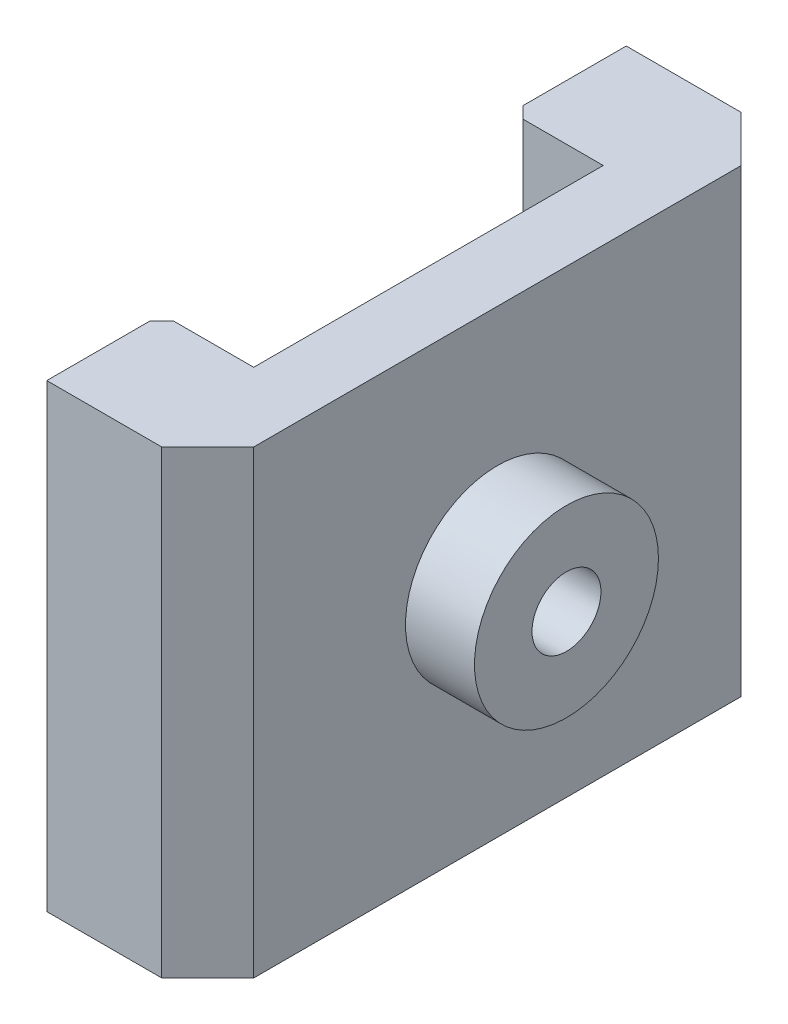
ISO-10303-21;
HEADER;
FILE_DESCRIPTION(('STEP AP214'),'2;1');
FILE_NAME('part.step','',(''),(''),'','','');
FILE_SCHEMA(('AUTOMOTIVE_DESIGN { 1 0 10303 214 1 1 1 1 }'));
ENDSEC;
DATA;
#1=APPLICATION_CONTEXT('core data for automotive mechanical design processes');
#2=APPLICATION_PROTOCOL_DEFINITION('international standard','automotive_design',2000,#1);
#3=PRODUCT_CONTEXT('',#1,'mechanical');
#4=PRODUCT('Part','Part','',(#3));
#5=PRODUCT_RELATED_PRODUCT_CATEGORY('part','',(#4));
#6=PRODUCT_DEFINITION_FORMATION('','',#4);
#7=PRODUCT_DEFINITION_CONTEXT('part definition',#1,'design');
#8=PRODUCT_DEFINITION('design','',#6,#7);
#9=PRODUCT_DEFINITION_SHAPE('','',#8);
#10=(LENGTH_UNIT() NAMED_UNIT(*) SI_UNIT(.MILLI.,.METRE.));
#11=(NAMED_UNIT(*) PLANE_ANGLE_UNIT() SI_UNIT($,.RADIAN.));
#12=(NAMED_UNIT(*) SI_UNIT($,.STERADIAN.) SOLID_ANGLE_UNIT());
#13=UNCERTAINTY_MEASURE_WITH_UNIT(LENGTH_MEASURE(1.E-05),#10,'distance_accuracy_value','');
#14=(GEOMETRIC_REPRESENTATION_CONTEXT(3) GLOBAL_UNCERTAINTY_ASSIGNED_CONTEXT((#13)) GLOBAL_UNIT_ASSIGNED_CONTEXT((#10,
#11,#12)) REPRESENTATION_CONTEXT('',''));
#15=CARTESIAN_POINT('',(0.,0.,0.));
#16=DIRECTION('',(0.,0.,1.));
#17=DIRECTION('',(1.,0.,0.));
#18=AXIS2_PLACEMENT_3D('',#15,#16,#17);
#19=CARTESIAN_POINT('',(-7.,20.,-7.6));
#20=DIRECTION('',(1.,0.,0.));
#21=DIRECTION('',(0.,0.,-1.));
#22=AXIS2_PLACEMENT_3D('',#19,#20,#21);
#23=PLANE('',#22);
#24=DIRECTION('',(0.,0.,1.));
#25=VECTOR('',#24,1.);
#26=CARTESIAN_POINT('',(-7.,0.,-7.6));
#27=LINE('',#26,#25);
#28=CARTESIAN_POINT('',(-7.,0.,-12.6));
#29=VERTEX_POINT('',#28);
#30=CARTESIAN_POINT('',(-7.,0.,-8.1));
#31=VERTEX_POINT('',#30);
#32=EDGE_CURVE('E166',#29,#31,#27,.T.);
#33=ORIENTED_EDGE('',*,*,#32,.T.);
#34=DIRECTION('',(0.,1.,0.));
#35=VECTOR('',#34,1.);
#36=CARTESIAN_POINT('',(-7.,20.,-8.1));
#37=LINE('',#36,#35);
#38=CARTESIAN_POINT('',(-7.,20.,-8.1));
#39=VERTEX_POINT('',#38);
#40=EDGE_CURVE('E214',#31,#39,#37,.T.);
#41=ORIENTED_EDGE('',*,*,#40,.T.);
#42=DIRECTION('',(0.,0.,1.));
#43=VECTOR('',#42,1.);
#44=CARTESIAN_POINT('',(-7.,20.,-7.6));
#45=LINE('',#44,#43);
#46=CARTESIAN_POINT('',(-7.,20.,-12.6));
#47=VERTEX_POINT('',#46);
#48=EDGE_CURVE('E136',#47,#39,#45,.T.);
#49=ORIENTED_EDGE('',*,*,#48,.F.);
#50=DIRECTION('',(0.,-1.,0.));
#51=VECTOR('',#50,1.);
#52=CARTESIAN_POINT('',(-7.,20.,-12.6));
#53=LINE('',#52,#51);
#54=EDGE_CURVE('E165',#47,#29,#53,.T.);
#55=ORIENTED_EDGE('',*,*,#54,.T.);
#56=EDGE_LOOP('',(#33,#41,#49,#55));
#57=FACE_BOUND('',#56,.T.);
#58=ADVANCED_FACE('F35',(#57),#23,.F.);
#59=CARTESIAN_POINT('',(-3.,20.,-7.6));
#60=DIRECTION('',(0.,0.,-1.));
#61=DIRECTION('',(-1.,0.,0.));
#62=AXIS2_PLACEMENT_3D('',#59,#60,#61);
#63=PLANE('',#62);
#64=DIRECTION('',(1.,0.,0.));
#65=VECTOR('',#64,1.);
#66=CARTESIAN_POINT('',(-3.,20.,-7.6));
#67=LINE('',#66,#65);
#68=CARTESIAN_POINT('',(-6.5,20.,-7.6));
#69=VERTEX_POINT('',#68);
#70=CARTESIAN_POINT('',(-3.,20.,-7.6));
#71=VERTEX_POINT('',#70);
#72=EDGE_CURVE('E124',#69,#71,#67,.T.);
#73=ORIENTED_EDGE('',*,*,#72,.F.);
#74=DIRECTION('',(0.,-1.,0.));
#75=VECTOR('',#74,1.);
#76=CARTESIAN_POINT('',(-6.5,20.,-7.6));
#77=LINE('',#76,#75);
#78=CARTESIAN_POINT('',(-6.5,0.,-7.6));
#79=VERTEX_POINT('',#78);
#80=EDGE_CURVE('E208',#69,#79,#77,.T.);
#81=ORIENTED_EDGE('',*,*,#80,.T.);
#82=DIRECTION('',(1.,0.,0.));
#83=VECTOR('',#82,1.);
#84=CARTESIAN_POINT('',(-3.,0.,-7.6));
#85=LINE('',#84,#83);
#86=CARTESIAN_POINT('',(-3.,0.,-7.6));
#87=VERTEX_POINT('',#86);
#88=EDGE_CURVE('E142',#79,#87,#85,.T.);
#89=ORIENTED_EDGE('',*,*,#88,.T.);
#90=DIRECTION('',(0.,-1.,0.));
#91=VECTOR('',#90,1.);
#92=CARTESIAN_POINT('',(-3.,20.,-7.6));
#93=LINE('',#92,#91);
#94=EDGE_CURVE('E139',#71,#87,#93,.T.);
#95=ORIENTED_EDGE('',*,*,#94,.F.);
#96=EDGE_LOOP('',(#73,#81,#89,#95));
#97=FACE_BOUND('',#96,.T.);
#98=ADVANCED_FACE('F140',(#97),#63,.F.);
#99=CARTESIAN_POINT('',(-3.,20.,7.6));
#100=DIRECTION('',(1.,0.,0.));
#101=DIRECTION('',(0.,0.,-1.));
#102=AXIS2_PLACEMENT_3D('',#99,#100,#101);
#103=PLANE('',#102);
#104=CARTESIAN_POINT('',(-3.,10.,0.));
#105=DIRECTION('',(1.,0.,0.));
#106=DIRECTION('',(0.,0.,-1.));
#107=AXIS2_PLACEMENT_3D('',#104,#105,#106);
#108=CIRCLE('',#107,1.5);
#109=CARTESIAN_POINT('',(-3.,10.,-1.5));
#110=VERTEX_POINT('',#109);
#111=EDGE_CURVE('E258',#110,#110,#108,.T.);
#112=ORIENTED_EDGE('',*,*,#111,.T.);
#113=EDGE_LOOP('',(#112));
#114=FACE_BOUND('',#113,.T.);
#115=DIRECTION('',(0.,0.,1.));
#116=VECTOR('',#115,1.);
#117=CARTESIAN_POINT('',(-3.,0.,7.6));
#118=LINE('',#117,#116);
#119=CARTESIAN_POINT('',(-3.,0.,7.6));
#120=VERTEX_POINT('',#119);
#121=EDGE_CURVE('E171',#87,#120,#118,.T.);
#122=ORIENTED_EDGE('',*,*,#121,.T.);
#123=DIRECTION('',(0.,-1.,0.));
#124=VECTOR('',#123,1.);
#125=CARTESIAN_POINT('',(-3.,20.,7.6));
#126=LINE('',#125,#124);
#127=CARTESIAN_POINT('',(-3.,20.,7.6));
#128=VERTEX_POINT('',#127);
#129=EDGE_CURVE('E146',#128,#120,#126,.T.);
#130=ORIENTED_EDGE('',*,*,#129,.F.);
#131=DIRECTION('',(0.,0.,1.));
#132=VECTOR('',#131,1.);
#133=CARTESIAN_POINT('',(-3.,20.,7.6));
#134=LINE('',#133,#132);
#135=EDGE_CURVE('E129',#71,#128,#134,.T.);
#136=ORIENTED_EDGE('',*,*,#135,.F.);
#137=ORIENTED_EDGE('',*,*,#94,.T.);
#138=EDGE_LOOP('',(#122,#130,#136,#137));
#139=FACE_BOUND('',#138,.T.);
#140=ADVANCED_FACE('F148',(#114,#139),#103,.F.);
#141=CARTESIAN_POINT('',(-7.,20.,7.6));
#142=DIRECTION('',(0.,0.,1.));
#143=DIRECTION('',(1.,0.,0.));
#144=AXIS2_PLACEMENT_3D('',#141,#142,#143);
#145=PLANE('',#144);
#146=DIRECTION('',(-1.,0.,0.));
#147=VECTOR('',#146,1.);
#148=CARTESIAN_POINT('',(-7.,0.,7.6));
#149=LINE('',#148,#147);
#150=CARTESIAN_POINT('',(-6.49999999999999,0.,7.6));
#151=VERTEX_POINT('',#150);
#152=EDGE_CURVE('E173',#120,#151,#149,.T.);
#153=ORIENTED_EDGE('',*,*,#152,.T.);
#154=DIRECTION('',(0.,1.,0.));
#155=VECTOR('',#154,1.);
#156=CARTESIAN_POINT('',(-6.49999999999999,20.,7.6));
#157=LINE('',#156,#155);
#158=CARTESIAN_POINT('',(-6.49999999999999,20.,7.6));
#159=VERTEX_POINT('',#158);
#160=EDGE_CURVE('E39',#151,#159,#157,.T.);
#161=ORIENTED_EDGE('',*,*,#160,.T.);
#162=DIRECTION('',(-1.,0.,0.));
#163=VECTOR('',#162,1.);
#164=CARTESIAN_POINT('',(-7.,20.,7.6));
#165=LINE('',#164,#163);
#166=EDGE_CURVE('E150',#128,#159,#165,.T.);
#167=ORIENTED_EDGE('',*,*,#166,.F.);
#168=ORIENTED_EDGE('',*,*,#129,.T.);
#169=EDGE_LOOP('',(#153,#161,#167,#168));
#170=FACE_BOUND('',#169,.T.);
#171=ADVANCED_FACE('F307',(#170),#145,.F.);
#172=CARTESIAN_POINT('',(-7.,20.,12.6));
#173=DIRECTION('',(1.,0.,0.));
#174=DIRECTION('',(0.,0.,-1.));
#175=AXIS2_PLACEMENT_3D('',#172,#173,#174);
#176=PLANE('',#175);
#177=DIRECTION('',(0.,0.,1.));
#178=VECTOR('',#177,1.);
#179=CARTESIAN_POINT('',(-7.,20.,12.6));
#180=LINE('',#179,#178);
#181=CARTESIAN_POINT('',(-7.,20.,8.10000000000001));
#182=VERTEX_POINT('',#181);
#183=CARTESIAN_POINT('',(-7.,20.,12.6));
#184=VERTEX_POINT('',#183);
#185=EDGE_CURVE('E152',#182,#184,#180,.T.);
#186=ORIENTED_EDGE('',*,*,#185,.F.);
#187=DIRECTION('',(0.,-1.,0.));
#188=VECTOR('',#187,1.);
#189=CARTESIAN_POINT('',(-7.,20.,8.10000000000001));
#190=LINE('',#189,#188);
#191=CARTESIAN_POINT('',(-7.,0.,8.10000000000001));
#192=VERTEX_POINT('',#191);
#193=EDGE_CURVE('E217',#182,#192,#190,.T.);
#194=ORIENTED_EDGE('',*,*,#193,.T.);
#195=DIRECTION('',(0.,0.,1.));
#196=VECTOR('',#195,1.);
#197=CARTESIAN_POINT('',(-7.,0.,12.6));
#198=LINE('',#197,#196);
#199=CARTESIAN_POINT('',(-7.,0.,12.6));
#200=VERTEX_POINT('',#199);
#201=EDGE_CURVE('E175',#192,#200,#198,.T.);
#202=ORIENTED_EDGE('',*,*,#201,.T.);
#203=DIRECTION('',(0.,-1.,0.));
#204=VECTOR('',#203,1.);
#205=CARTESIAN_POINT('',(-7.,20.,12.6));
#206=LINE('',#205,#204);
#207=EDGE_CURVE('E187',#184,#200,#206,.T.);
#208=ORIENTED_EDGE('',*,*,#207,.F.);
#209=EDGE_LOOP('',(#186,#194,#202,#208));
#210=FACE_BOUND('',#209,.T.);
#211=ADVANCED_FACE('F222',(#210),#176,.F.);
#212=CARTESIAN_POINT('',(0.,20.,12.6));
#213=DIRECTION('',(0.,0.,-1.));
#214=DIRECTION('',(-1.,0.,0.));
#215=AXIS2_PLACEMENT_3D('',#212,#213,#214);
#216=PLANE('',#215);
#217=DIRECTION('',(1.,0.,0.));
#218=VECTOR('',#217,1.);
#219=CARTESIAN_POINT('',(0.,0.,12.6));
#220=LINE('',#219,#218);
#221=CARTESIAN_POINT('',(-2.00000000000001,0.,12.6));
#222=VERTEX_POINT('',#221);
#223=EDGE_CURVE('E177',#200,#222,#220,.T.);
#224=ORIENTED_EDGE('',*,*,#223,.T.);
#225=DIRECTION('',(0.,1.,0.));
#226=VECTOR('',#225,1.);
#227=CARTESIAN_POINT('',(-2.00000000000001,20.,12.6));
#228=LINE('',#227,#226);
#229=CARTESIAN_POINT('',(-2.00000000000001,20.,12.6));
#230=VERTEX_POINT('',#229);
#231=EDGE_CURVE('E206',#222,#230,#228,.T.);
#232=ORIENTED_EDGE('',*,*,#231,.T.);
#233=DIRECTION('',(1.,0.,0.));
#234=VECTOR('',#233,1.);
#235=CARTESIAN_POINT('',(0.,20.,12.6));
#236=LINE('',#235,#234);
#237=EDGE_CURVE('E157',#184,#230,#236,.T.);
#238=ORIENTED_EDGE('',*,*,#237,.F.);
#239=ORIENTED_EDGE('',*,*,#207,.T.);
#240=EDGE_LOOP('',(#224,#232,#238,#239));
#241=FACE_BOUND('',#240,.T.);
#242=ADVANCED_FACE('F232',(#241),#216,.F.);
#243=CARTESIAN_POINT('',(0.,20.,-12.6));
#244=DIRECTION('',(-1.,0.,0.));
#245=DIRECTION('',(0.,0.,1.));
#246=AXIS2_PLACEMENT_3D('',#243,#244,#245);
#247=PLANE('',#246);
#248=CARTESIAN_POINT('',(0.,10.,0.));
#249=DIRECTION('',(1.,0.,0.));
#250=DIRECTION('',(0.,0.,-1.));
#251=AXIS2_PLACEMENT_3D('',#248,#249,#250);
#252=CIRCLE('',#251,4.);
#253=CARTESIAN_POINT('',(0.,10.,-4.));
#254=VERTEX_POINT('',#253);
#255=EDGE_CURVE('E11',#254,#254,#252,.T.);
#256=ORIENTED_EDGE('',*,*,#255,.F.);
#257=EDGE_LOOP('',(#256));
#258=FACE_BOUND('',#257,.T.);
#259=DIRECTION('',(0.,0.,-1.));
#260=VECTOR('',#259,1.);
#261=CARTESIAN_POINT('',(0.,0.,-12.6));
#262=LINE('',#261,#260);
#263=CARTESIAN_POINT('',(0.,0.,10.6));
#264=VERTEX_POINT('',#263);
#265=CARTESIAN_POINT('',(0.,0.,-10.6));
#266=VERTEX_POINT('',#265);
#267=EDGE_CURVE('E180',#264,#266,#262,.T.);
#268=ORIENTED_EDGE('',*,*,#267,.T.);
#269=DIRECTION('',(0.,1.,0.));
#270=VECTOR('',#269,1.);
#271=CARTESIAN_POINT('',(0.,20.,-10.6));
#272=LINE('',#271,#270);
#273=CARTESIAN_POINT('',(0.,20.,-10.6));
#274=VERTEX_POINT('',#273);
#275=EDGE_CURVE('E200',#266,#274,#272,.T.);
#276=ORIENTED_EDGE('',*,*,#275,.T.);
#277=DIRECTION('',(0.,0.,-1.));
#278=VECTOR('',#277,1.);
#279=CARTESIAN_POINT('',(0.,20.,-12.6));
#280=LINE('',#279,#278);
#281=CARTESIAN_POINT('',(0.,20.,10.6));
#282=VERTEX_POINT('',#281);
#283=EDGE_CURVE('E160',#282,#274,#280,.T.);
#284=ORIENTED_EDGE('',*,*,#283,.F.);
#285=DIRECTION('',(0.,-1.,0.));
#286=VECTOR('',#285,1.);
#287=CARTESIAN_POINT('',(0.,20.,10.6));
#288=LINE('',#287,#286);
#289=EDGE_CURVE('E197',#282,#264,#288,.T.);
#290=ORIENTED_EDGE('',*,*,#289,.T.);
#291=EDGE_LOOP('',(#268,#276,#284,#290));
#292=FACE_BOUND('',#291,.T.);
#293=ADVANCED_FACE('F241',(#258,#292),#247,.F.);
#294=CARTESIAN_POINT('',(-7.,20.,-12.6));
#295=DIRECTION('',(0.,0.,1.));
#296=DIRECTION('',(1.,0.,0.));
#297=AXIS2_PLACEMENT_3D('',#294,#295,#296);
#298=PLANE('',#297);
#299=DIRECTION('',(-1.,0.,0.));
#300=VECTOR('',#299,1.);
#301=CARTESIAN_POINT('',(-7.,20.,-12.6));
#302=LINE('',#301,#300);
#303=CARTESIAN_POINT('',(-2.,20.,-12.6));
#304=VERTEX_POINT('',#303);
#305=EDGE_CURVE('E163',#304,#47,#302,.T.);
#306=ORIENTED_EDGE('',*,*,#305,.F.);
#307=DIRECTION('',(0.,-1.,0.));
#308=VECTOR('',#307,1.);
#309=CARTESIAN_POINT('',(-2.,20.,-12.6));
#310=LINE('',#309,#308);
#311=CARTESIAN_POINT('',(-2.,0.,-12.6));
#312=VERTEX_POINT('',#311);
#313=EDGE_CURVE('E145',#304,#312,#310,.T.);
#314=ORIENTED_EDGE('',*,*,#313,.T.);
#315=DIRECTION('',(-1.,0.,0.));
#316=VECTOR('',#315,1.);
#317=CARTESIAN_POINT('',(-7.,0.,-12.6));
#318=LINE('',#317,#316);
#319=EDGE_CURVE('E183',#312,#29,#318,.T.);
#320=ORIENTED_EDGE('',*,*,#319,.T.);
#321=ORIENTED_EDGE('',*,*,#54,.F.);
#322=EDGE_LOOP('',(#306,#314,#320,#321));
#323=FACE_BOUND('',#322,.T.);
#324=ADVANCED_FACE('F249',(#323),#298,.F.);
#325=CARTESIAN_POINT('',(0.,20.,0.));
#326=DIRECTION('',(0.,-1.,0.));
#327=DIRECTION('',(0.,0.,-1.));
#328=AXIS2_PLACEMENT_3D('',#325,#326,#327);
#329=PLANE('',#328);
#330=ORIENTED_EDGE('',*,*,#48,.T.);
#331=DIRECTION('',(-0.707106781186546,0.,-0.707106781186549));
#332=VECTOR('',#331,1.);
#333=CARTESIAN_POINT('',(-6.5,20.,-7.6));
#334=LINE('',#333,#332);
#335=EDGE_CURVE('E132',#39,#69,#334,.F.);
#336=ORIENTED_EDGE('',*,*,#335,.T.);
#337=ORIENTED_EDGE('',*,*,#72,.T.);
#338=ORIENTED_EDGE('',*,*,#135,.T.);
#339=ORIENTED_EDGE('',*,*,#166,.T.);
#340=DIRECTION('',(0.707106781186551,0.,-0.707106781186544));
#341=VECTOR('',#340,1.);
#342=CARTESIAN_POINT('',(-7.,20.,8.10000000000001));
#343=LINE('',#342,#341);
#344=EDGE_CURVE('E51',#159,#182,#343,.F.);
#345=ORIENTED_EDGE('',*,*,#344,.T.);
#346=ORIENTED_EDGE('',*,*,#185,.T.);
#347=ORIENTED_EDGE('',*,*,#237,.T.);
#348=DIRECTION('',(-0.707106781186548,0.,0.707106781186547));
#349=VECTOR('',#348,1.);
#350=CARTESIAN_POINT('',(0.,20.,10.6));
#351=LINE('',#350,#349);
#352=EDGE_CURVE('E202',#230,#282,#351,.F.);
#353=ORIENTED_EDGE('',*,*,#352,.T.);
#354=ORIENTED_EDGE('',*,*,#283,.T.);
#355=DIRECTION('',(0.707106781186547,0.,0.707106781186548));
#356=VECTOR('',#355,1.);
#357=CARTESIAN_POINT('',(-2.,20.,-12.6));
#358=LINE('',#357,#356);
#359=EDGE_CURVE('E204',#274,#304,#358,.F.);
#360=ORIENTED_EDGE('',*,*,#359,.T.);
#361=ORIENTED_EDGE('',*,*,#305,.T.);
#362=EDGE_LOOP('',(#330,#336,#337,#338,#339,#345,#346,#347,#353,#354,#360,#361));
#363=FACE_BOUND('',#362,.T.);
#364=ADVANCED_FACE('F127',(#363),#329,.F.);
#365=CARTESIAN_POINT('',(0.,0.,0.));
#366=DIRECTION('',(0.,-1.,0.));
#367=DIRECTION('',(0.,0.,-1.));
#368=AXIS2_PLACEMENT_3D('',#365,#366,#367);
#369=PLANE('',#368);
#370=ORIENTED_EDGE('',*,*,#88,.F.);
#371=DIRECTION('',(0.707106781186546,0.,0.707106781186549));
#372=VECTOR('',#371,1.);
#373=CARTESIAN_POINT('',(0.549999999999982,0.,-0.54999999999998));
#374=LINE('',#373,#372);
#375=EDGE_CURVE('E212',#79,#31,#374,.F.);
#376=ORIENTED_EDGE('',*,*,#375,.T.);
#377=ORIENTED_EDGE('',*,*,#32,.F.);
#378=ORIENTED_EDGE('',*,*,#319,.F.);
#379=DIRECTION('',(-0.707106781186547,0.,-0.707106781186548));
#380=VECTOR('',#379,1.);
#381=CARTESIAN_POINT('',(5.3,0.,-5.29999999999999));
#382=LINE('',#381,#380);
#383=EDGE_CURVE('E195',#312,#266,#382,.F.);
#384=ORIENTED_EDGE('',*,*,#383,.T.);
#385=ORIENTED_EDGE('',*,*,#267,.F.);
#386=DIRECTION('',(0.707106781186548,0.,-0.707106781186547));
#387=VECTOR('',#386,1.);
#388=CARTESIAN_POINT('',(5.3,0.,5.30000000000001));
#389=LINE('',#388,#387);
#390=EDGE_CURVE('E193',#264,#222,#389,.F.);
#391=ORIENTED_EDGE('',*,*,#390,.T.);
#392=ORIENTED_EDGE('',*,*,#223,.F.);
#393=ORIENTED_EDGE('',*,*,#201,.F.);
#394=DIRECTION('',(-0.707106781186551,0.,0.707106781186544));
#395=VECTOR('',#394,1.);
#396=CARTESIAN_POINT('',(0.550000000000034,0.,0.550000000000039));
#397=LINE('',#396,#395);
#398=EDGE_CURVE('E210',#192,#151,#397,.F.);
#399=ORIENTED_EDGE('',*,*,#398,.T.);
#400=ORIENTED_EDGE('',*,*,#152,.F.);
#401=ORIENTED_EDGE('',*,*,#121,.F.);
#402=EDGE_LOOP('',(#370,#376,#377,#378,#384,#385,#391,#392,#393,#399,#400,#401));
#403=FACE_BOUND('',#402,.T.);
#404=ADVANCED_FACE('F227',(#403),#369,.T.);
#405=CARTESIAN_POINT('',(-2.,20.,-12.6));
#406=DIRECTION('',(-0.707106781186548,0.,0.707106781186547));
#407=DIRECTION('',(0.,-1.,0.));
#408=AXIS2_PLACEMENT_3D('',#405,#406,#407);
#409=PLANE('',#408);
#410=ORIENTED_EDGE('',*,*,#359,.F.);
#411=ORIENTED_EDGE('',*,*,#275,.F.);
#412=ORIENTED_EDGE('',*,*,#383,.F.);
#413=ORIENTED_EDGE('',*,*,#313,.F.);
#414=EDGE_LOOP('',(#410,#411,#412,#413));
#415=FACE_BOUND('',#414,.T.);
#416=ADVANCED_FACE('F244',(#415),#409,.F.);
#417=CARTESIAN_POINT('',(0.,20.,10.6));
#418=DIRECTION('',(-0.707106781186547,0.,-0.707106781186548));
#419=DIRECTION('',(0.,-1.,0.));
#420=AXIS2_PLACEMENT_3D('',#417,#418,#419);
#421=PLANE('',#420);
#422=ORIENTED_EDGE('',*,*,#352,.F.);
#423=ORIENTED_EDGE('',*,*,#231,.F.);
#424=ORIENTED_EDGE('',*,*,#390,.F.);
#425=ORIENTED_EDGE('',*,*,#289,.F.);
#426=EDGE_LOOP('',(#422,#423,#424,#425));
#427=FACE_BOUND('',#426,.T.);
#428=ADVANCED_FACE('F236',(#427),#421,.F.);
#429=CARTESIAN_POINT('',(-6.5,20.,-7.6));
#430=DIRECTION('',(0.707106781186549,0.,-0.707106781186546));
#431=DIRECTION('',(0.,-1.,0.));
#432=AXIS2_PLACEMENT_3D('',#429,#430,#431);
#433=PLANE('',#432);
#434=ORIENTED_EDGE('',*,*,#335,.F.);
#435=ORIENTED_EDGE('',*,*,#40,.F.);
#436=ORIENTED_EDGE('',*,*,#375,.F.);
#437=ORIENTED_EDGE('',*,*,#80,.F.);
#438=EDGE_LOOP('',(#434,#435,#436,#437));
#439=FACE_BOUND('',#438,.T.);
#440=ADVANCED_FACE('F301',(#439),#433,.F.);
#441=CARTESIAN_POINT('',(-7.,20.,8.10000000000001));
#442=DIRECTION('',(0.707106781186544,0.,0.707106781186551));
#443=DIRECTION('',(0.,-1.,0.));
#444=AXIS2_PLACEMENT_3D('',#441,#442,#443);
#445=PLANE('',#444);
#446=ORIENTED_EDGE('',*,*,#344,.F.);
#447=ORIENTED_EDGE('',*,*,#160,.F.);
#448=ORIENTED_EDGE('',*,*,#398,.F.);
#449=ORIENTED_EDGE('',*,*,#193,.F.);
#450=EDGE_LOOP('',(#446,#447,#448,#449));
#451=FACE_BOUND('',#450,.T.);
#452=ADVANCED_FACE('F37',(#451),#445,.F.);
#453=CARTESIAN_POINT('',(3.,10.,0.));
#454=DIRECTION('',(-1.,0.,0.));
#455=DIRECTION('',(0.,0.,1.));
#456=AXIS2_PLACEMENT_3D('',#453,#454,#455);
#457=CYLINDRICAL_SURFACE('',#456,4.);
#458=CARTESIAN_POINT('',(3.,10.,0.));
#459=DIRECTION('',(1.,0.,0.));
#460=DIRECTION('',(0.,0.,-1.));
#461=AXIS2_PLACEMENT_3D('',#458,#459,#460);
#462=CIRCLE('',#461,4.);
#463=CARTESIAN_POINT('',(3.,10.,-4.));
#464=VERTEX_POINT('',#463);
#465=EDGE_CURVE('E169',#464,#464,#462,.T.);
#466=ORIENTED_EDGE('',*,*,#465,.F.);
#467=EDGE_LOOP('',(#466));
#468=FACE_BOUND('',#467,.T.);
#469=ORIENTED_EDGE('',*,*,#255,.T.);
#470=EDGE_LOOP('',(#469));
#471=FACE_BOUND('',#470,.T.);
#472=ADVANCED_FACE('F271',(#468,#471),#457,.T.);
#473=CARTESIAN_POINT('',(3.,10.,0.));
#474=DIRECTION('',(1.,0.,0.));
#475=DIRECTION('',(0.,0.,-1.));
#476=AXIS2_PLACEMENT_3D('',#473,#474,#475);
#477=PLANE('',#476);
#478=CARTESIAN_POINT('',(3.,10.,0.));
#479=DIRECTION('',(1.,0.,0.));
#480=DIRECTION('',(0.,0.,-1.));
#481=AXIS2_PLACEMENT_3D('',#478,#479,#480);
#482=CIRCLE('',#481,1.5);
#483=CARTESIAN_POINT('',(3.,10.,-1.5));
#484=VERTEX_POINT('',#483);
#485=EDGE_CURVE('E261',#484,#484,#482,.T.);
#486=ORIENTED_EDGE('',*,*,#485,.F.);
#487=EDGE_LOOP('',(#486));
#488=FACE_BOUND('',#487,.T.);
#489=ORIENTED_EDGE('',*,*,#465,.T.);
#490=EDGE_LOOP('',(#489));
#491=FACE_BOUND('',#490,.T.);
#492=ADVANCED_FACE('F268',(#488,#491),#477,.T.);
#493=CARTESIAN_POINT('',(-7.,10.,0.));
#494=DIRECTION('',(1.,0.,0.));
#495=DIRECTION('',(0.,0.,-1.));
#496=AXIS2_PLACEMENT_3D('',#493,#494,#495);
#497=CYLINDRICAL_SURFACE('',#496,1.5);
#498=ORIENTED_EDGE('',*,*,#485,.T.);
#499=EDGE_LOOP('',(#498));
#500=FACE_BOUND('',#499,.T.);
#501=ORIENTED_EDGE('',*,*,#111,.F.);
#502=EDGE_LOOP('',(#501));
#503=FACE_BOUND('',#502,.T.);
#504=ADVANCED_FACE('F265',(#500,#503),#497,.F.);
#505=CLOSED_SHELL('',(#58,#98,#140,#171,#211,#242,#293,#324,#364,#404,#416,#428,#440,#452,#472,
#492,#504));
#506=MANIFOLD_SOLID_BREP('B2',#505);
#507=ADVANCED_BREP_SHAPE_REPRESENTATION('',(#18,#506),#14);
#508=SHAPE_DEFINITION_REPRESENTATION(#9,#507);
ENDSEC;
END-ISO-10303-21;
